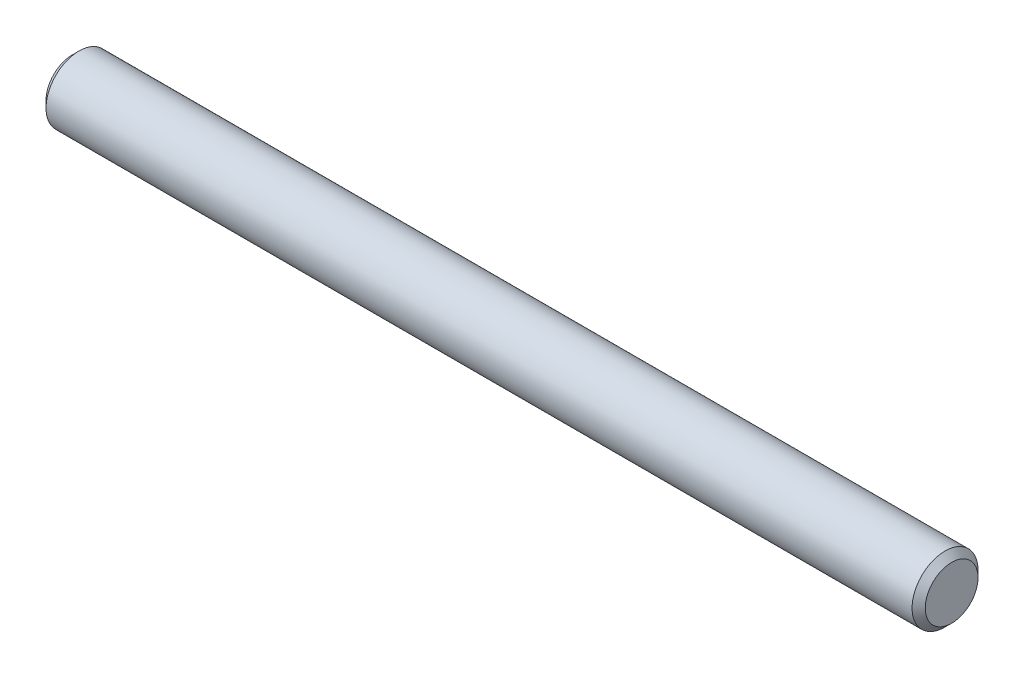
ISO-10303-21;
HEADER;
FILE_DESCRIPTION(('STEP AP214'),'2;1');
FILE_NAME('part.step','',(''),(''),'','','');
FILE_SCHEMA(('AUTOMOTIVE_DESIGN { 1 0 10303 214 1 1 1 1 }'));
ENDSEC;
DATA;
#1=APPLICATION_CONTEXT('core data for automotive mechanical design processes');
#2=APPLICATION_PROTOCOL_DEFINITION('international standard','automotive_design',2000,#1);
#3=PRODUCT_CONTEXT('',#1,'mechanical');
#4=PRODUCT('Part','Part','',(#3));
#5=PRODUCT_RELATED_PRODUCT_CATEGORY('part','',(#4));
#6=PRODUCT_DEFINITION_FORMATION('','',#4);
#7=PRODUCT_DEFINITION_CONTEXT('part definition',#1,'design');
#8=PRODUCT_DEFINITION('design','',#6,#7);
#9=PRODUCT_DEFINITION_SHAPE('','',#8);
#10=(LENGTH_UNIT() NAMED_UNIT(*) SI_UNIT(.MILLI.,.METRE.));
#11=(NAMED_UNIT(*) PLANE_ANGLE_UNIT() SI_UNIT($,.RADIAN.));
#12=(NAMED_UNIT(*) SI_UNIT($,.STERADIAN.) SOLID_ANGLE_UNIT());
#13=UNCERTAINTY_MEASURE_WITH_UNIT(LENGTH_MEASURE(1.E-05),#10,'distance_accuracy_value','');
#14=(GEOMETRIC_REPRESENTATION_CONTEXT(3) GLOBAL_UNCERTAINTY_ASSIGNED_CONTEXT((#13)) GLOBAL_UNIT_ASSIGNED_CONTEXT((#10,
#11,#12)) REPRESENTATION_CONTEXT('',''));
#15=CARTESIAN_POINT('',(0.,0.,0.));
#16=DIRECTION('',(0.,0.,1.));
#17=DIRECTION('',(1.,0.,0.));
#18=AXIS2_PLACEMENT_3D('',#15,#16,#17);
#19=CARTESIAN_POINT('',(-63.5,0.,0.));
#20=DIRECTION('',(1.,0.,0.));
#21=DIRECTION('',(0.,0.,-1.));
#22=AXIS2_PLACEMENT_3D('',#19,#20,#21);
#23=CYLINDRICAL_SURFACE('',#22,4.7625);
#24=CARTESIAN_POINT('',(62.5475,0.,0.));
#25=DIRECTION('',(1.,0.,0.));
#26=DIRECTION('',(0.,0.,-1.));
#27=AXIS2_PLACEMENT_3D('',#24,#25,#26);
#28=CIRCLE('',#27,4.7625);
#29=CARTESIAN_POINT('',(62.5475,0.,-4.7625));
#30=VERTEX_POINT('',#29);
#31=EDGE_CURVE('E37',#30,#30,#28,.F.);
#32=ORIENTED_EDGE('',*,*,#31,.T.);
#33=EDGE_LOOP('',(#32));
#34=FACE_BOUND('',#33,.T.);
#35=CARTESIAN_POINT('',(-62.5474999999999,0.,0.));
#36=DIRECTION('',(1.,0.,0.));
#37=DIRECTION('',(0.,0.,-1.));
#38=AXIS2_PLACEMENT_3D('',#35,#36,#37);
#39=CIRCLE('',#38,4.7625);
#40=CARTESIAN_POINT('',(-62.5474999999999,0.,-4.7625));
#41=VERTEX_POINT('',#40);
#42=EDGE_CURVE('E41',#41,#41,#39,.T.);
#43=ORIENTED_EDGE('',*,*,#42,.T.);
#44=EDGE_LOOP('',(#43));
#45=FACE_BOUND('',#44,.T.);
#46=ADVANCED_FACE('F30',(#34,#45),#23,.T.);
#47=CARTESIAN_POINT('',(-63.5,0.,0.));
#48=DIRECTION('',(1.,0.,0.));
#49=DIRECTION('',(0.,0.,-1.));
#50=AXIS2_PLACEMENT_3D('',#47,#48,#49);
#51=PLANE('',#50);
#52=CARTESIAN_POINT('',(-63.5,0.,0.));
#53=DIRECTION('',(1.,0.,0.));
#54=DIRECTION('',(0.,0.,-1.));
#55=AXIS2_PLACEMENT_3D('',#52,#53,#54);
#56=CIRCLE('',#55,3.80999999999995);
#57=CARTESIAN_POINT('',(-63.5,0.,-3.80999999999995));
#58=VERTEX_POINT('',#57);
#59=EDGE_CURVE('E10',#58,#58,#56,.F.);
#60=ORIENTED_EDGE('',*,*,#59,.T.);
#61=EDGE_LOOP('',(#60));
#62=FACE_BOUND('',#61,.T.);
#63=ADVANCED_FACE('F61',(#62),#51,.F.);
#64=CARTESIAN_POINT('',(63.5,0.,0.));
#65=DIRECTION('',(1.,0.,0.));
#66=DIRECTION('',(0.,0.,-1.));
#67=AXIS2_PLACEMENT_3D('',#64,#65,#66);
#68=PLANE('',#67);
#69=CARTESIAN_POINT('',(63.5,0.,0.));
#70=DIRECTION('',(1.,0.,0.));
#71=DIRECTION('',(0.,0.,-1.));
#72=AXIS2_PLACEMENT_3D('',#69,#70,#71);
#73=CIRCLE('',#72,3.81000000000002);
#74=CARTESIAN_POINT('',(63.5,0.,-3.81000000000002));
#75=VERTEX_POINT('',#74);
#76=EDGE_CURVE('E45',#75,#75,#73,.T.);
#77=ORIENTED_EDGE('',*,*,#76,.T.);
#78=EDGE_LOOP('',(#77));
#79=FACE_BOUND('',#78,.T.);
#80=ADVANCED_FACE('F51',(#79),#68,.T.);
#81=CARTESIAN_POINT('',(63.5,0.,0.));
#82=DIRECTION('',(-1.,0.,0.));
#83=DIRECTION('',(0.,0.,1.));
#84=AXIS2_PLACEMENT_3D('',#81,#82,#83);
#85=CONICAL_SURFACE('',#84,3.81000000000002,0.785398163397454);
#86=ORIENTED_EDGE('',*,*,#31,.F.);
#87=EDGE_LOOP('',(#86));
#88=FACE_BOUND('',#87,.T.);
#89=ORIENTED_EDGE('',*,*,#76,.F.);
#90=EDGE_LOOP('',(#89));
#91=FACE_BOUND('',#90,.T.);
#92=ADVANCED_FACE('F53',(#88,#91),#85,.T.);
#93=CARTESIAN_POINT('',(-62.5474999999999,0.,0.));
#94=DIRECTION('',(1.,0.,0.));
#95=DIRECTION('',(0.,0.,-1.));
#96=AXIS2_PLACEMENT_3D('',#93,#94,#95);
#97=CONICAL_SURFACE('',#96,4.7625,0.785398163397447);
#98=ORIENTED_EDGE('',*,*,#59,.F.);
#99=EDGE_LOOP('',(#98));
#100=FACE_BOUND('',#99,.T.);
#101=ORIENTED_EDGE('',*,*,#42,.F.);
#102=EDGE_LOOP('',(#101));
#103=FACE_BOUND('',#102,.T.);
#104=ADVANCED_FACE('F32',(#100,#103),#97,.T.);
#105=CLOSED_SHELL('',(#46,#63,#80,#92,#104));
#106=MANIFOLD_SOLID_BREP('B2',#105);
#107=ADVANCED_BREP_SHAPE_REPRESENTATION('',(#18,#106),#14);
#108=SHAPE_DEFINITION_REPRESENTATION(#9,#107);
ENDSEC;
END-ISO-10303-21;
